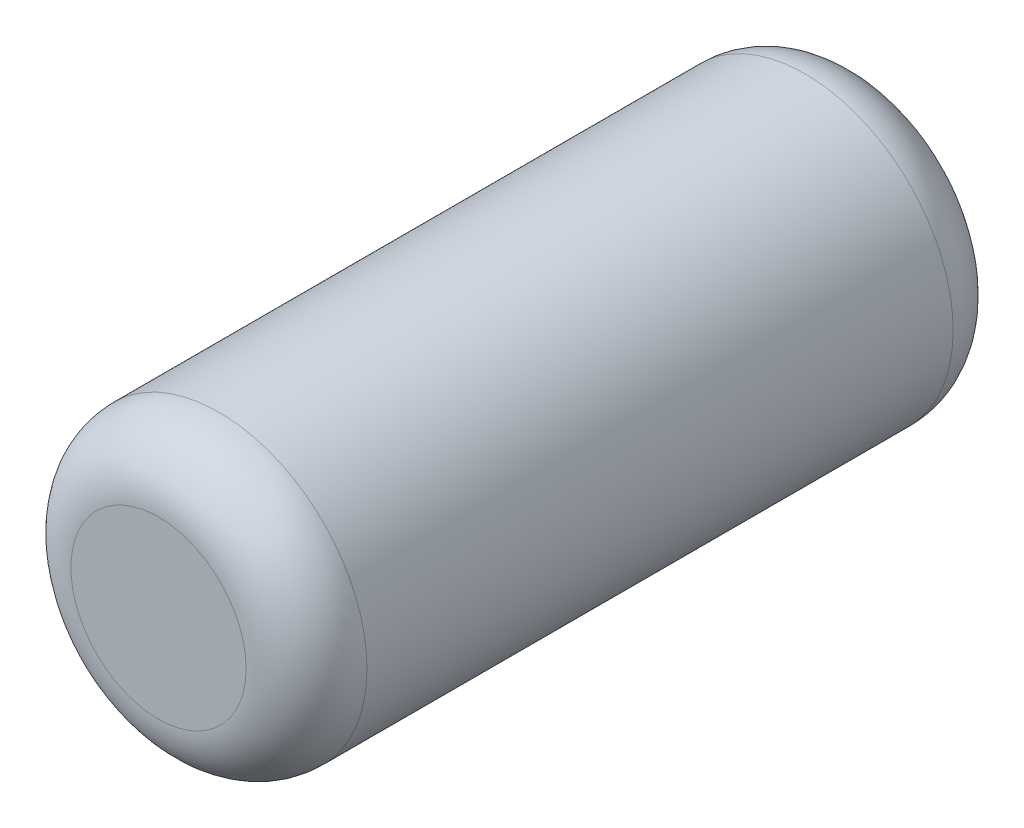
ISO-10303-21;
HEADER;
FILE_DESCRIPTION(('STEP AP214'),'2;1');
FILE_NAME('part.step','',(''),(''),'','','');
FILE_SCHEMA(('AUTOMOTIVE_DESIGN { 1 0 10303 214 1 1 1 1 }'));
ENDSEC;
DATA;
#1=APPLICATION_CONTEXT('core data for automotive mechanical design processes');
#2=APPLICATION_PROTOCOL_DEFINITION('international standard','automotive_design',2000,#1);
#3=PRODUCT_CONTEXT('',#1,'mechanical');
#4=PRODUCT('Part','Part','',(#3));
#5=PRODUCT_RELATED_PRODUCT_CATEGORY('part','',(#4));
#6=PRODUCT_DEFINITION_FORMATION('','',#4);
#7=PRODUCT_DEFINITION_CONTEXT('part definition',#1,'design');
#8=PRODUCT_DEFINITION('design','',#6,#7);
#9=PRODUCT_DEFINITION_SHAPE('','',#8);
#10=(LENGTH_UNIT() NAMED_UNIT(*) SI_UNIT(.MILLI.,.METRE.));
#11=(NAMED_UNIT(*) PLANE_ANGLE_UNIT() SI_UNIT($,.RADIAN.));
#12=(NAMED_UNIT(*) SI_UNIT($,.STERADIAN.) SOLID_ANGLE_UNIT());
#13=UNCERTAINTY_MEASURE_WITH_UNIT(LENGTH_MEASURE(1.E-05),#10,'distance_accuracy_value','');
#14=(GEOMETRIC_REPRESENTATION_CONTEXT(3) GLOBAL_UNCERTAINTY_ASSIGNED_CONTEXT((#13)) GLOBAL_UNIT_ASSIGNED_CONTEXT((#10,
#11,#12)) REPRESENTATION_CONTEXT('',''));
#15=CARTESIAN_POINT('',(0.,0.,0.));
#16=DIRECTION('',(0.,0.,1.));
#17=DIRECTION('',(1.,0.,0.));
#18=AXIS2_PLACEMENT_3D('',#15,#16,#17);
#19=CARTESIAN_POINT('',(0.,0.,117.));
#20=DIRECTION('',(0.,0.,-1.));
#21=DIRECTION('',(-1.,0.,0.));
#22=AXIS2_PLACEMENT_3D('',#19,#20,#21);
#23=CYLINDRICAL_SURFACE('',#22,49.);
#24=CARTESIAN_POINT('',(0.,0.,97.));
#25=DIRECTION('',(0.,0.,1.));
#26=DIRECTION('',(1.,0.,0.));
#27=AXIS2_PLACEMENT_3D('',#24,#25,#26);
#28=CIRCLE('',#27,49.);
#29=CARTESIAN_POINT('',(49.,0.,97.));
#30=VERTEX_POINT('',#29);
#31=EDGE_CURVE('E52',#30,#30,#28,.F.);
#32=ORIENTED_EDGE('',*,*,#31,.T.);
#33=EDGE_LOOP('',(#32));
#34=FACE_BOUND('',#33,.T.);
#35=CARTESIAN_POINT('',(0.,0.,-97.));
#36=DIRECTION('',(0.,0.,1.));
#37=DIRECTION('',(1.,0.,0.));
#38=AXIS2_PLACEMENT_3D('',#35,#36,#37);
#39=CIRCLE('',#38,49.);
#40=CARTESIAN_POINT('',(49.,0.,-97.));
#41=VERTEX_POINT('',#40);
#42=EDGE_CURVE('E56',#41,#41,#39,.T.);
#43=ORIENTED_EDGE('',*,*,#42,.T.);
#44=EDGE_LOOP('',(#43));
#45=FACE_BOUND('',#44,.T.);
#46=ADVANCED_FACE('F45',(#34,#45),#23,.T.);
#47=CARTESIAN_POINT('',(0.,0.,117.));
#48=DIRECTION('',(0.,0.,1.));
#49=DIRECTION('',(1.,0.,0.));
#50=AXIS2_PLACEMENT_3D('',#47,#48,#49);
#51=PLANE('',#50);
#52=CARTESIAN_POINT('',(0.,0.,117.));
#53=DIRECTION('',(0.,0.,1.));
#54=DIRECTION('',(1.,0.,0.));
#55=AXIS2_PLACEMENT_3D('',#52,#53,#54);
#56=CIRCLE('',#55,29.);
#57=CARTESIAN_POINT('',(29.,0.,117.));
#58=VERTEX_POINT('',#57);
#59=EDGE_CURVE('E60',#58,#58,#56,.T.);
#60=ORIENTED_EDGE('',*,*,#59,.T.);
#61=EDGE_LOOP('',(#60));
#62=FACE_BOUND('',#61,.T.);
#63=ADVANCED_FACE('F66',(#62),#51,.T.);
#64=CARTESIAN_POINT('',(0.,0.,-117.));
#65=DIRECTION('',(0.,0.,1.));
#66=DIRECTION('',(1.,0.,0.));
#67=AXIS2_PLACEMENT_3D('',#64,#65,#66);
#68=PLANE('',#67);
#69=CARTESIAN_POINT('',(0.,0.,-117.));
#70=DIRECTION('',(0.,0.,1.));
#71=DIRECTION('',(1.,0.,0.));
#72=AXIS2_PLACEMENT_3D('',#69,#70,#71);
#73=CIRCLE('',#72,29.);
#74=CARTESIAN_POINT('',(29.,0.,-117.));
#75=VERTEX_POINT('',#74);
#76=EDGE_CURVE('E10',#75,#75,#73,.F.);
#77=ORIENTED_EDGE('',*,*,#76,.T.);
#78=EDGE_LOOP('',(#77));
#79=FACE_BOUND('',#78,.T.);
#80=ADVANCED_FACE('F70',(#79),#68,.F.);
#81=CARTESIAN_POINT('',(0.,0.,97.));
#82=DIRECTION('',(0.,0.,1.));
#83=DIRECTION('',(1.,0.,0.));
#84=AXIS2_PLACEMENT_3D('',#81,#82,#83);
#85=TOROIDAL_SURFACE('',#84,29.,20.);
#86=ORIENTED_EDGE('',*,*,#31,.F.);
#87=EDGE_LOOP('',(#86));
#88=FACE_BOUND('',#87,.T.);
#89=ORIENTED_EDGE('',*,*,#59,.F.);
#90=EDGE_LOOP('',(#89));
#91=FACE_BOUND('',#90,.T.);
#92=ADVANCED_FACE('F68',(#88,#91),#85,.T.);
#93=CARTESIAN_POINT('',(0.,0.,-97.));
#94=DIRECTION('',(0.,0.,1.));
#95=DIRECTION('',(1.,0.,0.));
#96=AXIS2_PLACEMENT_3D('',#93,#94,#95);
#97=TOROIDAL_SURFACE('',#96,29.,20.);
#98=ORIENTED_EDGE('',*,*,#76,.F.);
#99=EDGE_LOOP('',(#98));
#100=FACE_BOUND('',#99,.T.);
#101=ORIENTED_EDGE('',*,*,#42,.F.);
#102=EDGE_LOOP('',(#101));
#103=FACE_BOUND('',#102,.T.);
#104=ADVANCED_FACE('F47',(#100,#103),#97,.T.);
#105=CLOSED_SHELL('',(#46,#63,#80,#92,#104));
#106=MANIFOLD_SOLID_BREP('B2',#105);
#107=ADVANCED_BREP_SHAPE_REPRESENTATION('',(#18,#106),#14);
#108=SHAPE_DEFINITION_REPRESENTATION(#9,#107);
ENDSEC;
END-ISO-10303-21;
